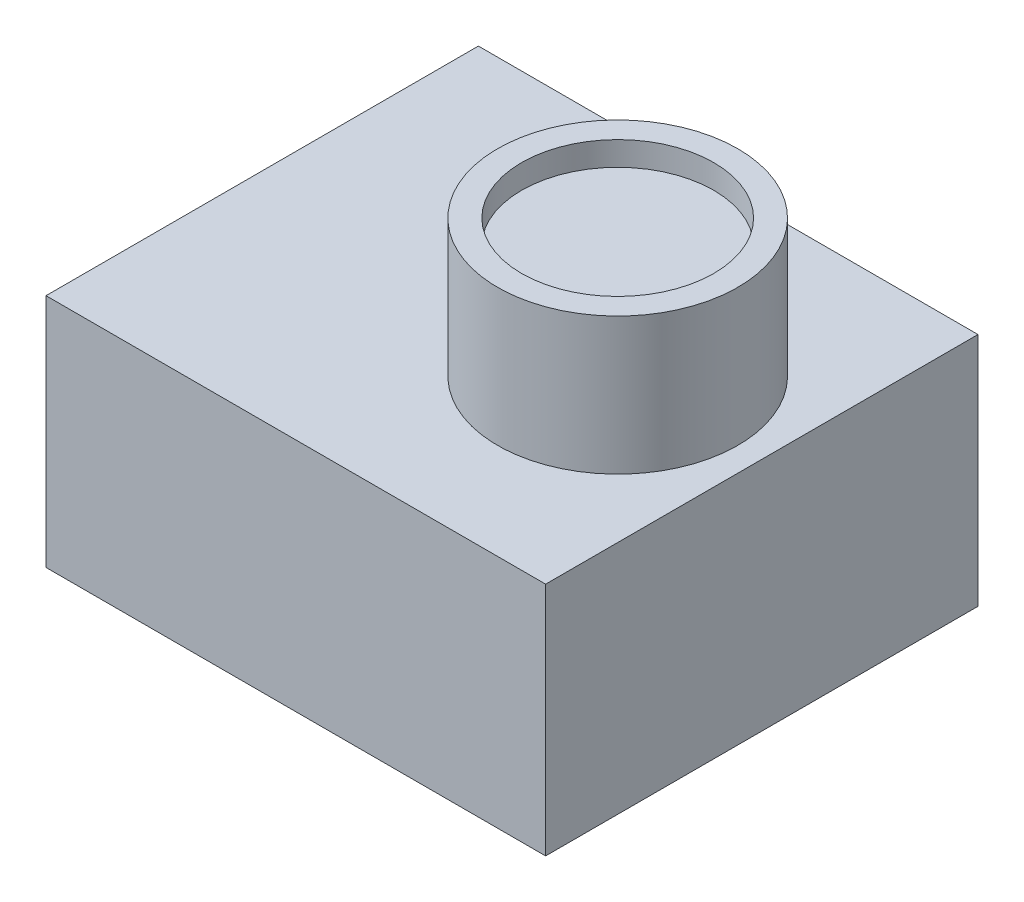
ISO-10303-21;
HEADER;
FILE_DESCRIPTION(('STEP AP214'),'2;1');
FILE_NAME('part.step','',(''),(''),'','','');
FILE_SCHEMA(('AUTOMOTIVE_DESIGN { 1 0 10303 214 1 1 1 1 }'));
ENDSEC;
DATA;
#1=APPLICATION_CONTEXT('core data for automotive mechanical design processes');
#2=APPLICATION_PROTOCOL_DEFINITION('international standard','automotive_design',2000,#1);
#3=PRODUCT_CONTEXT('',#1,'mechanical');
#4=PRODUCT('Part','Part','',(#3));
#5=PRODUCT_RELATED_PRODUCT_CATEGORY('part','',(#4));
#6=PRODUCT_DEFINITION_FORMATION('','',#4);
#7=PRODUCT_DEFINITION_CONTEXT('part definition',#1,'design');
#8=PRODUCT_DEFINITION('design','',#6,#7);
#9=PRODUCT_DEFINITION_SHAPE('','',#8);
#10=(LENGTH_UNIT() NAMED_UNIT(*) SI_UNIT(.MILLI.,.METRE.));
#11=(NAMED_UNIT(*) PLANE_ANGLE_UNIT() SI_UNIT($,.RADIAN.));
#12=(NAMED_UNIT(*) SI_UNIT($,.STERADIAN.) SOLID_ANGLE_UNIT());
#13=UNCERTAINTY_MEASURE_WITH_UNIT(LENGTH_MEASURE(1.E-05),#10,'distance_accuracy_value','');
#14=(GEOMETRIC_REPRESENTATION_CONTEXT(3) GLOBAL_UNCERTAINTY_ASSIGNED_CONTEXT((#13)) GLOBAL_UNIT_ASSIGNED_CONTEXT((#10,
#11,#12)) REPRESENTATION_CONTEXT('',''));
#15=CARTESIAN_POINT('',(0.,0.,0.));
#16=DIRECTION('',(0.,0.,1.));
#17=DIRECTION('',(1.,0.,0.));
#18=AXIS2_PLACEMENT_3D('',#15,#16,#17);
#19=CARTESIAN_POINT('',(104.,98.,90.));
#20=DIRECTION('',(-1.,0.,0.));
#21=DIRECTION('',(0.,0.,1.));
#22=AXIS2_PLACEMENT_3D('',#19,#20,#21);
#23=PLANE('',#22);
#24=DIRECTION('',(0.,0.,-1.));
#25=VECTOR('',#24,1.);
#26=CARTESIAN_POINT('',(104.,0.,90.));
#27=LINE('',#26,#25);
#28=CARTESIAN_POINT('',(104.,0.,90.));
#29=VERTEX_POINT('',#28);
#30=CARTESIAN_POINT('',(104.,0.,-90.));
#31=VERTEX_POINT('',#30);
#32=EDGE_CURVE('E107',#29,#31,#27,.T.);
#33=ORIENTED_EDGE('',*,*,#32,.T.);
#34=DIRECTION('',(0.,-1.,0.));
#35=VECTOR('',#34,1.);
#36=CARTESIAN_POINT('',(104.,98.,-90.));
#37=LINE('',#36,#35);
#38=CARTESIAN_POINT('',(104.,98.,-90.));
#39=VERTEX_POINT('',#38);
#40=EDGE_CURVE('E44',#39,#31,#37,.T.);
#41=ORIENTED_EDGE('',*,*,#40,.F.);
#42=DIRECTION('',(0.,0.,-1.));
#43=VECTOR('',#42,1.);
#44=CARTESIAN_POINT('',(104.,98.,90.));
#45=LINE('',#44,#43);
#46=CARTESIAN_POINT('',(104.,98.,90.));
#47=VERTEX_POINT('',#46);
#48=EDGE_CURVE('E94',#47,#39,#45,.T.);
#49=ORIENTED_EDGE('',*,*,#48,.F.);
#50=DIRECTION('',(0.,-1.,0.));
#51=VECTOR('',#50,1.);
#52=CARTESIAN_POINT('',(104.,98.,90.));
#53=LINE('',#52,#51);
#54=EDGE_CURVE('E103',#47,#29,#53,.T.);
#55=ORIENTED_EDGE('',*,*,#54,.T.);
#56=EDGE_LOOP('',(#33,#41,#49,#55));
#57=FACE_BOUND('',#56,.T.);
#58=ADVANCED_FACE('F41',(#57),#23,.F.);
#59=CARTESIAN_POINT('',(-104.,98.,-90.));
#60=DIRECTION('',(0.,0.,1.));
#61=DIRECTION('',(1.,0.,0.));
#62=AXIS2_PLACEMENT_3D('',#59,#60,#61);
#63=PLANE('',#62);
#64=DIRECTION('',(-1.,0.,0.));
#65=VECTOR('',#64,1.);
#66=CARTESIAN_POINT('',(-104.,0.,-90.));
#67=LINE('',#66,#65);
#68=CARTESIAN_POINT('',(-104.,0.,-90.));
#69=VERTEX_POINT('',#68);
#70=EDGE_CURVE('E99',#31,#69,#67,.T.);
#71=ORIENTED_EDGE('',*,*,#70,.T.);
#72=DIRECTION('',(0.,-1.,0.));
#73=VECTOR('',#72,1.);
#74=CARTESIAN_POINT('',(-104.,98.,-90.));
#75=LINE('',#74,#73);
#76=CARTESIAN_POINT('',(-104.,98.,-90.));
#77=VERTEX_POINT('',#76);
#78=EDGE_CURVE('E97',#77,#69,#75,.T.);
#79=ORIENTED_EDGE('',*,*,#78,.F.);
#80=DIRECTION('',(-1.,0.,0.));
#81=VECTOR('',#80,1.);
#82=CARTESIAN_POINT('',(-104.,98.,-90.));
#83=LINE('',#82,#81);
#84=EDGE_CURVE('E89',#39,#77,#83,.T.);
#85=ORIENTED_EDGE('',*,*,#84,.F.);
#86=ORIENTED_EDGE('',*,*,#40,.T.);
#87=EDGE_LOOP('',(#71,#79,#85,#86));
#88=FACE_BOUND('',#87,.T.);
#89=ADVANCED_FACE('F98',(#88),#63,.F.);
#90=CARTESIAN_POINT('',(-104.,98.,90.));
#91=DIRECTION('',(1.,0.,0.));
#92=DIRECTION('',(0.,0.,-1.));
#93=AXIS2_PLACEMENT_3D('',#90,#91,#92);
#94=PLANE('',#93);
#95=DIRECTION('',(0.,0.,1.));
#96=VECTOR('',#95,1.);
#97=CARTESIAN_POINT('',(-104.,0.,90.));
#98=LINE('',#97,#96);
#99=CARTESIAN_POINT('',(-104.,0.,90.));
#100=VERTEX_POINT('',#99);
#101=EDGE_CURVE('E75',#69,#100,#98,.T.);
#102=ORIENTED_EDGE('',*,*,#101,.T.);
#103=DIRECTION('',(0.,-1.,0.));
#104=VECTOR('',#103,1.);
#105=CARTESIAN_POINT('',(-104.,98.,90.));
#106=LINE('',#105,#104);
#107=CARTESIAN_POINT('',(-104.,98.,90.));
#108=VERTEX_POINT('',#107);
#109=EDGE_CURVE('E100',#108,#100,#106,.T.);
#110=ORIENTED_EDGE('',*,*,#109,.F.);
#111=DIRECTION('',(0.,0.,1.));
#112=VECTOR('',#111,1.);
#113=CARTESIAN_POINT('',(-104.,98.,90.));
#114=LINE('',#113,#112);
#115=EDGE_CURVE('E92',#77,#108,#114,.T.);
#116=ORIENTED_EDGE('',*,*,#115,.F.);
#117=ORIENTED_EDGE('',*,*,#78,.T.);
#118=EDGE_LOOP('',(#102,#110,#116,#117));
#119=FACE_BOUND('',#118,.T.);
#120=ADVANCED_FACE('F101',(#119),#94,.F.);
#121=CARTESIAN_POINT('',(-104.,98.,90.));
#122=DIRECTION('',(0.,0.,-1.));
#123=DIRECTION('',(-1.,0.,0.));
#124=AXIS2_PLACEMENT_3D('',#121,#122,#123);
#125=PLANE('',#124);
#126=DIRECTION('',(1.,0.,0.));
#127=VECTOR('',#126,1.);
#128=CARTESIAN_POINT('',(-104.,0.,90.));
#129=LINE('',#128,#127);
#130=EDGE_CURVE('E81',#100,#29,#129,.T.);
#131=ORIENTED_EDGE('',*,*,#130,.T.);
#132=ORIENTED_EDGE('',*,*,#54,.F.);
#133=DIRECTION('',(1.,0.,0.));
#134=VECTOR('',#133,1.);
#135=CARTESIAN_POINT('',(-104.,98.,90.));
#136=LINE('',#135,#134);
#137=EDGE_CURVE('E58',#108,#47,#136,.T.);
#138=ORIENTED_EDGE('',*,*,#137,.F.);
#139=ORIENTED_EDGE('',*,*,#109,.T.);
#140=EDGE_LOOP('',(#131,#132,#138,#139));
#141=FACE_BOUND('',#140,.T.);
#142=ADVANCED_FACE('F115',(#141),#125,.F.);
#143=CARTESIAN_POINT('',(0.,98.,0.));
#144=DIRECTION('',(0.,-1.,0.));
#145=DIRECTION('',(0.,0.,-1.));
#146=AXIS2_PLACEMENT_3D('',#143,#144,#145);
#147=PLANE('',#146);
#148=CARTESIAN_POINT('',(44.,98.,0.));
#149=DIRECTION('',(0.,1.,0.));
#150=DIRECTION('',(0.,0.,1.));
#151=AXIS2_PLACEMENT_3D('',#148,#149,#150);
#152=CIRCLE('',#151,50.);
#153=CARTESIAN_POINT('',(44.,98.,-50.));
#154=VERTEX_POINT('',#153);
#155=EDGE_CURVE('E11',#154,#154,#152,.T.);
#156=ORIENTED_EDGE('',*,*,#155,.F.);
#157=EDGE_LOOP('',(#156));
#158=FACE_BOUND('',#157,.T.);
#159=ORIENTED_EDGE('',*,*,#48,.T.);
#160=ORIENTED_EDGE('',*,*,#84,.T.);
#161=ORIENTED_EDGE('',*,*,#115,.T.);
#162=ORIENTED_EDGE('',*,*,#137,.T.);
#163=EDGE_LOOP('',(#159,#160,#161,#162));
#164=FACE_BOUND('',#163,.T.);
#165=ADVANCED_FACE('F90',(#158,#164),#147,.F.);
#166=CARTESIAN_POINT('',(0.,0.,0.));
#167=DIRECTION('',(0.,-1.,0.));
#168=DIRECTION('',(0.,0.,-1.));
#169=AXIS2_PLACEMENT_3D('',#166,#167,#168);
#170=PLANE('',#169);
#171=ORIENTED_EDGE('',*,*,#32,.F.);
#172=ORIENTED_EDGE('',*,*,#130,.F.);
#173=ORIENTED_EDGE('',*,*,#101,.F.);
#174=ORIENTED_EDGE('',*,*,#70,.F.);
#175=EDGE_LOOP('',(#171,#172,#173,#174));
#176=FACE_BOUND('',#175,.T.);
#177=ADVANCED_FACE('F118',(#176),#170,.T.);
#178=CARTESIAN_POINT('',(44.,155.,0.));
#179=DIRECTION('',(0.,-1.,0.));
#180=DIRECTION('',(0.,0.,-1.));
#181=AXIS2_PLACEMENT_3D('',#178,#179,#180);
#182=CYLINDRICAL_SURFACE('',#181,50.);
#183=CARTESIAN_POINT('',(44.,155.,0.));
#184=DIRECTION('',(0.,1.,0.));
#185=DIRECTION('',(0.,0.,1.));
#186=AXIS2_PLACEMENT_3D('',#183,#184,#185);
#187=CIRCLE('',#186,50.);
#188=CARTESIAN_POINT('',(44.,155.,-50.));
#189=VERTEX_POINT('',#188);
#190=EDGE_CURVE('E110',#189,#189,#187,.T.);
#191=CARTESIAN_POINT('',(44.,155.,-50.));
#192=CARTESIAN_POINT('',(44.,154.40625,-50.));
#193=CARTESIAN_POINT('',(44.,153.8125,-50.));
#194=CARTESIAN_POINT('',(44.,152.625,-50.));
#195=CARTESIAN_POINT('',(44.,152.03125,-50.));
#196=CARTESIAN_POINT('',(44.,150.84375,-50.));
#197=CARTESIAN_POINT('',(44.,150.25,-50.));
#198=CARTESIAN_POINT('',(44.,149.0625,-50.));
#199=CARTESIAN_POINT('',(44.,148.46875,-50.));
#200=CARTESIAN_POINT('',(44.,147.28125,-50.));
#201=CARTESIAN_POINT('',(44.,146.6875,-50.));
#202=CARTESIAN_POINT('',(44.,145.5,-50.));
#203=CARTESIAN_POINT('',(44.,144.90625,-50.));
#204=CARTESIAN_POINT('',(44.,143.71875,-50.));
#205=CARTESIAN_POINT('',(44.,143.125,-50.));
#206=CARTESIAN_POINT('',(44.,141.9375,-50.));
#207=CARTESIAN_POINT('',(44.,141.34375,-50.));
#208=CARTESIAN_POINT('',(44.,140.15625,-50.));
#209=CARTESIAN_POINT('',(44.,139.5625,-50.));
#210=CARTESIAN_POINT('',(44.,138.375,-50.));
#211=CARTESIAN_POINT('',(44.,137.78125,-50.));
#212=CARTESIAN_POINT('',(44.,136.59375,-50.));
#213=CARTESIAN_POINT('',(44.,136.,-50.));
#214=CARTESIAN_POINT('',(44.,134.8125,-50.));
#215=CARTESIAN_POINT('',(44.,134.21875,-50.));
#216=CARTESIAN_POINT('',(44.,133.03125,-50.));
#217=CARTESIAN_POINT('',(44.,132.4375,-50.));
#218=CARTESIAN_POINT('',(44.,131.25,-50.));
#219=CARTESIAN_POINT('',(44.,130.65625,-50.));
#220=CARTESIAN_POINT('',(44.,129.46875,-50.));
#221=CARTESIAN_POINT('',(44.,128.875,-50.));
#222=CARTESIAN_POINT('',(44.,127.6875,-50.));
#223=CARTESIAN_POINT('',(44.,127.09375,-50.));
#224=CARTESIAN_POINT('',(44.,125.90625,-50.));
#225=CARTESIAN_POINT('',(44.,125.3125,-50.));
#226=CARTESIAN_POINT('',(44.,124.125,-50.));
#227=CARTESIAN_POINT('',(44.,123.53125,-50.));
#228=CARTESIAN_POINT('',(44.,122.34375,-50.));
#229=CARTESIAN_POINT('',(44.,121.75,-50.));
#230=CARTESIAN_POINT('',(44.,120.5625,-50.));
#231=CARTESIAN_POINT('',(44.,119.96875,-50.));
#232=CARTESIAN_POINT('',(44.,118.78125,-50.));
#233=CARTESIAN_POINT('',(44.,118.1875,-50.));
#234=CARTESIAN_POINT('',(44.,117.,-50.));
#235=CARTESIAN_POINT('',(44.,116.40625,-50.));
#236=CARTESIAN_POINT('',(44.,115.21875,-50.));
#237=CARTESIAN_POINT('',(44.,114.625,-50.));
#238=CARTESIAN_POINT('',(44.,113.4375,-50.));
#239=CARTESIAN_POINT('',(44.,112.84375,-50.));
#240=CARTESIAN_POINT('',(44.,111.65625,-50.));
#241=CARTESIAN_POINT('',(44.,111.0625,-50.));
#242=CARTESIAN_POINT('',(44.,109.875,-50.));
#243=CARTESIAN_POINT('',(44.,109.28125,-50.));
#244=CARTESIAN_POINT('',(44.,108.09375,-50.));
#245=CARTESIAN_POINT('',(44.,107.5,-50.));
#246=CARTESIAN_POINT('',(44.,106.3125,-50.));
#247=CARTESIAN_POINT('',(44.,105.71875,-50.));
#248=CARTESIAN_POINT('',(44.,104.53125,-50.));
#249=CARTESIAN_POINT('',(44.,103.9375,-50.));
#250=CARTESIAN_POINT('',(44.,102.75,-50.));
#251=CARTESIAN_POINT('',(44.,102.15625,-50.));
#252=CARTESIAN_POINT('',(44.,100.96875,-50.));
#253=CARTESIAN_POINT('',(44.,100.375,-50.));
#254=CARTESIAN_POINT('',(44.,99.1875,-50.));
#255=CARTESIAN_POINT('',(44.,98.59375,-50.));
#256=CARTESIAN_POINT('',(44.,98.,-50.));
#257=B_SPLINE_CURVE_WITH_KNOTS('',3,(#191,#192,#193,#194,#195,#196,#197,#198,#199,#200,#201,
#202,#203,#204,#205,#206,#207,#208,#209,#210,#211,#212,#213,#214,#215,#216,#217,#218,#219,#220,
#221,#222,#223,#224,#225,#226,#227,#228,#229,#230,#231,#232,#233,#234,#235,#236,#237,#238,#239,
#240,#241,#242,#243,#244,#245,#246,#247,#248,#249,#250,#251,#252,#253,#254,#255,#256),
.UNSPECIFIED.,.F.,.F.,(4,2,2,2,2,2,2,2,2,2,2,2,2,2,2,2,2,2,2,2,2,2,2,2,2,2,2,2,2,2,2,2,4),(0.,
1.78124999999998,3.5625,5.34374999999998,7.12499999999999,8.90624999999998,10.6875,12.46875,
14.25,16.03125,17.8125,19.59375,21.375,23.15625,24.9375,26.71875,28.5,30.28125,32.0625,33.84375,
35.625,37.40625,39.1875,40.96875,42.75,44.53125,46.3125,48.09375,49.875,51.65625,53.4375,
55.21875,57.),.UNSPECIFIED.);
#258=EDGE_CURVE('BSEAM141',#189,#154,#257,.T.);
#259=ORIENTED_EDGE('',*,*,#190,.F.);
#260=ORIENTED_EDGE('',*,*,#155,.T.);
#261=ORIENTED_EDGE('',*,*,#258,.T.);
#262=ORIENTED_EDGE('',*,*,#258,.F.);
#263=EDGE_LOOP('',(#259,#261,#260,#262));
#264=FACE_BOUND('',#263,.T.);
#265=ADVANCED_FACE('F141',(#264),#182,.T.);
#266=CARTESIAN_POINT('',(44.,155.,0.));
#267=DIRECTION('',(0.,1.,0.));
#268=DIRECTION('',(0.,0.,1.));
#269=AXIS2_PLACEMENT_3D('',#266,#267,#268);
#270=PLANE('',#269);
#271=CARTESIAN_POINT('',(44.,155.,0.));
#272=DIRECTION('',(0.,1.,0.));
#273=DIRECTION('',(0.,0.,1.));
#274=AXIS2_PLACEMENT_3D('',#271,#272,#273);
#275=CIRCLE('',#274,40.);
#276=CARTESIAN_POINT('',(44.,155.,40.));
#277=VERTEX_POINT('',#276);
#278=EDGE_CURVE('E124',#277,#277,#275,.T.);
#279=ORIENTED_EDGE('',*,*,#278,.F.);
#280=EDGE_LOOP('',(#279));
#281=FACE_BOUND('',#280,.T.);
#282=ORIENTED_EDGE('',*,*,#190,.T.);
#283=EDGE_LOOP('',(#282));
#284=FACE_BOUND('',#283,.T.);
#285=ADVANCED_FACE('F135',(#281,#284),#270,.T.);
#286=CARTESIAN_POINT('',(44.,145.,0.));
#287=DIRECTION('',(0.,1.,0.));
#288=DIRECTION('',(0.,0.,1.));
#289=AXIS2_PLACEMENT_3D('',#286,#287,#288);
#290=CYLINDRICAL_SURFACE('',#289,40.);
#291=CARTESIAN_POINT('',(44.,145.,0.));
#292=DIRECTION('',(0.,1.,0.));
#293=DIRECTION('',(0.,0.,1.));
#294=AXIS2_PLACEMENT_3D('',#291,#292,#293);
#295=CIRCLE('',#294,40.);
#296=CARTESIAN_POINT('',(44.,145.,40.));
#297=VERTEX_POINT('',#296);
#298=EDGE_CURVE('E123',#297,#297,#295,.T.);
#299=ORIENTED_EDGE('',*,*,#298,.F.);
#300=EDGE_LOOP('',(#299));
#301=FACE_BOUND('',#300,.T.);
#302=ORIENTED_EDGE('',*,*,#278,.T.);
#303=EDGE_LOOP('',(#302));
#304=FACE_BOUND('',#303,.T.);
#305=ADVANCED_FACE('F132',(#301,#304),#290,.F.);
#306=CARTESIAN_POINT('',(44.,145.,0.));
#307=DIRECTION('',(0.,1.,0.));
#308=DIRECTION('',(0.,0.,1.));
#309=AXIS2_PLACEMENT_3D('',#306,#307,#308);
#310=PLANE('',#309);
#311=ORIENTED_EDGE('',*,*,#298,.T.);
#312=EDGE_LOOP('',(#311));
#313=FACE_BOUND('',#312,.T.);
#314=ADVANCED_FACE('F130',(#313),#310,.T.);
#315=CLOSED_SHELL('',(#58,#89,#120,#142,#165,#177,#265,#285,#305,#314));
#316=MANIFOLD_SOLID_BREP('B2',#315);
#317=ADVANCED_BREP_SHAPE_REPRESENTATION('',(#18,#316),#14);
#318=SHAPE_DEFINITION_REPRESENTATION(#9,#317);
ENDSEC;
END-ISO-10303-21;
